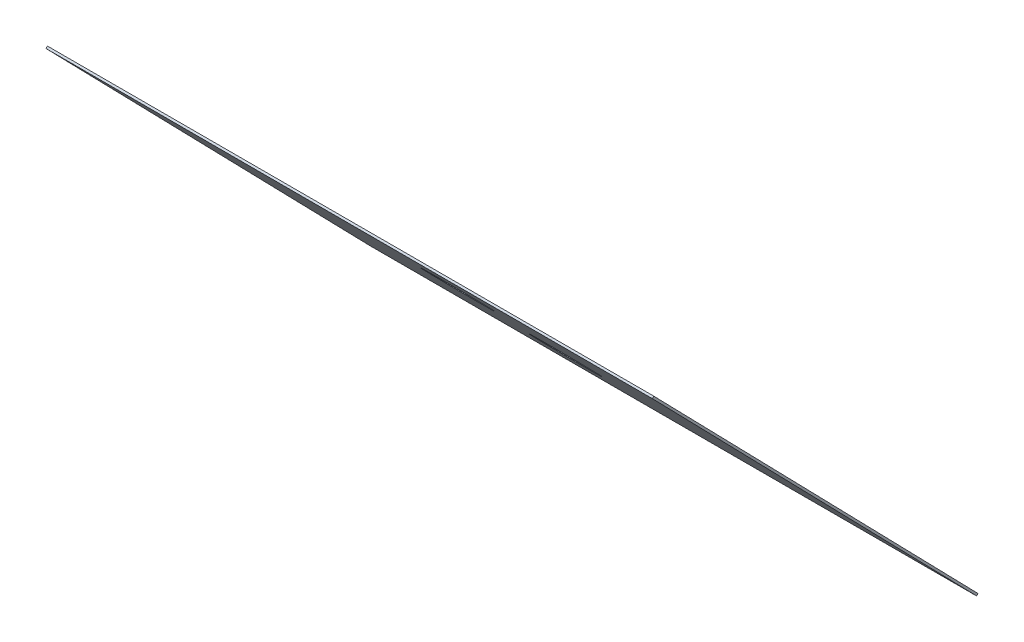
ISO-10303-21;
HEADER;
FILE_DESCRIPTION(('STEP AP214'),'2;1');
FILE_NAME('part.step','',(''),(''),'','','');
FILE_SCHEMA(('AUTOMOTIVE_DESIGN { 1 0 10303 214 1 1 1 1 }'));
ENDSEC;
DATA;
#1=APPLICATION_CONTEXT('core data for automotive mechanical design processes');
#2=APPLICATION_PROTOCOL_DEFINITION('international standard','automotive_design',2000,#1);
#3=PRODUCT_CONTEXT('',#1,'mechanical');
#4=PRODUCT('Part','Part','',(#3));
#5=PRODUCT_RELATED_PRODUCT_CATEGORY('part','',(#4));
#6=PRODUCT_DEFINITION_FORMATION('','',#4);
#7=PRODUCT_DEFINITION_CONTEXT('part definition',#1,'design');
#8=PRODUCT_DEFINITION('design','',#6,#7);
#9=PRODUCT_DEFINITION_SHAPE('','',#8);
#10=(LENGTH_UNIT() NAMED_UNIT(*) SI_UNIT(.MILLI.,.METRE.));
#11=(NAMED_UNIT(*) PLANE_ANGLE_UNIT() SI_UNIT($,.RADIAN.));
#12=(NAMED_UNIT(*) SI_UNIT($,.STERADIAN.) SOLID_ANGLE_UNIT());
#13=UNCERTAINTY_MEASURE_WITH_UNIT(LENGTH_MEASURE(1.E-05),#10,'distance_accuracy_value','');
#14=(GEOMETRIC_REPRESENTATION_CONTEXT(3) GLOBAL_UNCERTAINTY_ASSIGNED_CONTEXT((#13)) GLOBAL_UNIT_ASSIGNED_CONTEXT((#10,
#11,#12)) REPRESENTATION_CONTEXT('',''));
#15=CARTESIAN_POINT('',(0.,0.,0.));
#16=DIRECTION('',(0.,0.,1.));
#17=DIRECTION('',(1.,0.,0.));
#18=AXIS2_PLACEMENT_3D('',#15,#16,#17);
#19=CARTESIAN_POINT('',(0.,14.6685190391763,74.2782506140871));
#20=DIRECTION('',(-1.,0.,0.));
#21=DIRECTION('',(0.,-0.716524168938912,-0.697562266271909));
#22=AXIS2_PLACEMENT_3D('',#19,#20,#21);
#23=PLANE('',#22);
#24=DIRECTION('',(0.,-0.697562266271909,0.716524168938912));
#25=VECTOR('',#24,1.);
#26=CARTESIAN_POINT('',(0.,14.6685190391763,74.2782506140871));
#27=LINE('',#26,#25);
#28=CARTESIAN_POINT('',(0.,14.7382752658035,74.2065981971932));
#29=VERTEX_POINT('',#28);
#30=CARTESIAN_POINT('',(0.,14.6685190391763,74.2782506140871));
#31=VERTEX_POINT('',#30);
#32=EDGE_CURVE('E11',#29,#31,#27,.T.);
#33=ORIENTED_EDGE('',*,*,#32,.F.);
#34=DIRECTION('',(0.,-0.716524168938912,-0.697562266271909));
#35=VECTOR('',#34,1.);
#36=CARTESIAN_POINT('',(0.,14.7382752658035,74.2065981971932));
#37=LINE('',#36,#35);
#38=CARTESIAN_POINT('',(0.,-1.74178061979143,58.1626660729393));
#39=VERTEX_POINT('',#38);
#40=EDGE_CURVE('E88',#29,#39,#37,.T.);
#41=ORIENTED_EDGE('',*,*,#40,.T.);
#42=DIRECTION('',(0.,-0.697562266271909,0.716524168938912));
#43=VECTOR('',#42,1.);
#44=CARTESIAN_POINT('',(0.,-1.81153684641863,58.2343184898332));
#45=LINE('',#44,#43);
#46=CARTESIAN_POINT('',(0.,-1.81153684641863,58.2343184898332));
#47=VERTEX_POINT('',#46);
#48=EDGE_CURVE('E43',#39,#47,#45,.T.);
#49=ORIENTED_EDGE('',*,*,#48,.T.);
#50=DIRECTION('',(0.,-0.716524168938912,-0.697562266271909));
#51=VECTOR('',#50,1.);
#52=CARTESIAN_POINT('',(0.,14.6685190391763,74.2782506140871));
#53=LINE('',#52,#51);
#54=EDGE_CURVE('E105',#31,#47,#53,.T.);
#55=ORIENTED_EDGE('',*,*,#54,.F.);
#56=EDGE_LOOP('',(#33,#41,#49,#55));
#57=FACE_BOUND('',#56,.T.);
#58=ADVANCED_FACE('F33',(#57),#23,.T.);
#59=CARTESIAN_POINT('',(0.,-1.81153684641863,58.2343184898332));
#60=DIRECTION('',(0.,-0.716524168938912,-0.697562266271909));
#61=DIRECTION('',(1.,0.,0.));
#62=AXIS2_PLACEMENT_3D('',#59,#60,#61);
#63=PLANE('',#62);
#64=ORIENTED_EDGE('',*,*,#48,.F.);
#65=DIRECTION('',(1.,0.,0.));
#66=VECTOR('',#65,1.);
#67=CARTESIAN_POINT('',(0.,-1.74178061979143,58.1626660729393));
#68=LINE('',#67,#66);
#69=CARTESIAN_POINT('',(30.,-1.74178061979143,58.1626660729393));
#70=VERTEX_POINT('',#69);
#71=EDGE_CURVE('E99',#39,#70,#68,.T.);
#72=ORIENTED_EDGE('',*,*,#71,.T.);
#73=DIRECTION('',(0.,-0.697562266271909,0.716524168938912));
#74=VECTOR('',#73,1.);
#75=CARTESIAN_POINT('',(30.,-1.81153684641863,58.2343184898332));
#76=LINE('',#75,#74);
#77=CARTESIAN_POINT('',(30.,-1.81153684641863,58.2343184898332));
#78=VERTEX_POINT('',#77);
#79=EDGE_CURVE('E51',#70,#78,#76,.T.);
#80=ORIENTED_EDGE('',*,*,#79,.T.);
#81=DIRECTION('',(1.,0.,0.));
#82=VECTOR('',#81,1.);
#83=CARTESIAN_POINT('',(0.,-1.81153684641863,58.2343184898332));
#84=LINE('',#83,#82);
#85=EDGE_CURVE('E82',#47,#78,#84,.T.);
#86=ORIENTED_EDGE('',*,*,#85,.F.);
#87=EDGE_LOOP('',(#64,#72,#80,#86));
#88=FACE_BOUND('',#87,.T.);
#89=ADVANCED_FACE('F109',(#88),#63,.T.);
#90=CARTESIAN_POINT('',(30.,14.6685190391763,74.2782506140871));
#91=DIRECTION('',(-1.,0.,0.));
#92=DIRECTION('',(0.,-0.716524168938912,-0.697562266271909));
#93=AXIS2_PLACEMENT_3D('',#90,#91,#92);
#94=PLANE('',#93);
#95=ORIENTED_EDGE('',*,*,#79,.F.);
#96=DIRECTION('',(0.,-0.716524168938912,-0.697562266271909));
#97=VECTOR('',#96,1.);
#98=CARTESIAN_POINT('',(30.,14.7382752658035,74.2065981971932));
#99=LINE('',#98,#97);
#100=CARTESIAN_POINT('',(30.,14.7382752658035,74.2065981971932));
#101=VERTEX_POINT('',#100);
#102=EDGE_CURVE('E87',#101,#70,#99,.T.);
#103=ORIENTED_EDGE('',*,*,#102,.F.);
#104=DIRECTION('',(0.,-0.697562266271909,0.716524168938912));
#105=VECTOR('',#104,1.);
#106=CARTESIAN_POINT('',(30.,14.6685190391763,74.2782506140871));
#107=LINE('',#106,#105);
#108=CARTESIAN_POINT('',(30.,14.6685190391763,74.2782506140871));
#109=VERTEX_POINT('',#108);
#110=EDGE_CURVE('E37',#101,#109,#107,.T.);
#111=ORIENTED_EDGE('',*,*,#110,.T.);
#112=DIRECTION('',(0.,-0.716524168938912,-0.697562266271909));
#113=VECTOR('',#112,1.);
#114=CARTESIAN_POINT('',(30.,14.6685190391763,74.2782506140871));
#115=LINE('',#114,#113);
#116=EDGE_CURVE('E101',#109,#78,#115,.T.);
#117=ORIENTED_EDGE('',*,*,#116,.T.);
#118=EDGE_LOOP('',(#95,#103,#111,#117));
#119=FACE_BOUND('',#118,.T.);
#120=ADVANCED_FACE('F90',(#119),#94,.F.);
#121=CARTESIAN_POINT('',(0.,14.6685190391763,74.2782506140871));
#122=DIRECTION('',(0.,-0.716524168938912,-0.697562266271909));
#123=DIRECTION('',(1.,0.,0.));
#124=AXIS2_PLACEMENT_3D('',#121,#122,#123);
#125=PLANE('',#124);
#126=DIRECTION('',(1.,0.,0.));
#127=VECTOR('',#126,1.);
#128=CARTESIAN_POINT('',(0.,14.7382752658035,74.2065981971932));
#129=LINE('',#128,#127);
#130=EDGE_CURVE('E76',#29,#101,#129,.T.);
#131=ORIENTED_EDGE('',*,*,#130,.F.);
#132=ORIENTED_EDGE('',*,*,#32,.T.);
#133=DIRECTION('',(1.,0.,0.));
#134=VECTOR('',#133,1.);
#135=CARTESIAN_POINT('',(0.,14.6685190391763,74.2782506140871));
#136=LINE('',#135,#134);
#137=EDGE_CURVE('E78',#31,#109,#136,.T.);
#138=ORIENTED_EDGE('',*,*,#137,.T.);
#139=ORIENTED_EDGE('',*,*,#110,.F.);
#140=EDGE_LOOP('',(#131,#132,#138,#139));
#141=FACE_BOUND('',#140,.T.);
#142=ADVANCED_FACE('F35',(#141),#125,.F.);
#143=CARTESIAN_POINT('',(0.,14.6685190391763,74.2782506140871));
#144=DIRECTION('',(0.,-0.697562266271909,0.716524168938912));
#145=DIRECTION('',(0.,-0.716524168938912,-0.697562266271909));
#146=AXIS2_PLACEMENT_3D('',#143,#144,#145);
#147=PLANE('',#146);
#148=CARTESIAN_POINT('',(15.,9.17516707731135,68.9302732393358));
#149=DIRECTION('',(0.,-0.69756226627191,0.716524168938911));
#150=DIRECTION('',(0.,-0.716524168938911,-0.69756226627191));
#151=AXIS2_PLACEMENT_3D('',#148,#149,#150);
#152=CIRCLE('',#151,1.5);
#153=CARTESIAN_POINT('',(15.,8.10038082390298,67.883929839928));
#154=VERTEX_POINT('',#153);
#155=EDGE_CURVE('E94',#154,#154,#152,.T.);
#156=ORIENTED_EDGE('',*,*,#155,.F.);
#157=EDGE_LOOP('',(#156));
#158=FACE_BOUND('',#157,.T.);
#159=CARTESIAN_POINT('',(15.,3.68181511544636,63.5822958645845));
#160=DIRECTION('',(0.,-0.69756226627191,0.716524168938911));
#161=DIRECTION('',(0.,-0.716524168938911,-0.69756226627191));
#162=AXIS2_PLACEMENT_3D('',#159,#160,#161);
#163=CIRCLE('',#162,1.5);
#164=CARTESIAN_POINT('',(15.,2.60702886203799,62.5359524651767));
#165=VERTEX_POINT('',#164);
#166=EDGE_CURVE('E116',#165,#165,#163,.T.);
#167=ORIENTED_EDGE('',*,*,#166,.F.);
#168=EDGE_LOOP('',(#167));
#169=FACE_BOUND('',#168,.T.);
#170=ORIENTED_EDGE('',*,*,#116,.F.);
#171=ORIENTED_EDGE('',*,*,#137,.F.);
#172=ORIENTED_EDGE('',*,*,#54,.T.);
#173=ORIENTED_EDGE('',*,*,#85,.T.);
#174=EDGE_LOOP('',(#170,#171,#172,#173));
#175=FACE_BOUND('',#174,.T.);
#176=ADVANCED_FACE('F108',(#158,#169,#175),#147,.T.);
#177=CARTESIAN_POINT('',(0.,14.7382752658035,74.2065981971932));
#178=DIRECTION('',(0.,-0.697562266271909,0.716524168938912));
#179=DIRECTION('',(0.,-0.716524168938912,-0.697562266271909));
#180=AXIS2_PLACEMENT_3D('',#177,#178,#179);
#181=PLANE('',#180);
#182=CARTESIAN_POINT('',(15.,9.24492330393854,68.858620822442));
#183=DIRECTION('',(0.,-0.697562266271909,0.716524168938912));
#184=DIRECTION('',(0.,-0.716524168938912,-0.697562266271909));
#185=AXIS2_PLACEMENT_3D('',#182,#183,#184);
#186=CIRCLE('',#185,1.5);
#187=CARTESIAN_POINT('',(15.,8.17013705053018,67.8122774230341));
#188=VERTEX_POINT('',#187);
#189=EDGE_CURVE('E91',#188,#188,#186,.F.);
#190=ORIENTED_EDGE('',*,*,#189,.F.);
#191=EDGE_LOOP('',(#190));
#192=FACE_BOUND('',#191,.T.);
#193=CARTESIAN_POINT('',(15.,3.75157134207355,63.5106434476906));
#194=DIRECTION('',(0.,-0.697562266271909,0.716524168938912));
#195=DIRECTION('',(0.,-0.716524168938912,-0.697562266271909));
#196=AXIS2_PLACEMENT_3D('',#193,#194,#195);
#197=CIRCLE('',#196,1.5);
#198=CARTESIAN_POINT('',(15.,2.67678508866518,62.4643000482828));
#199=VERTEX_POINT('',#198);
#200=EDGE_CURVE('E113',#199,#199,#197,.F.);
#201=ORIENTED_EDGE('',*,*,#200,.F.);
#202=EDGE_LOOP('',(#201));
#203=FACE_BOUND('',#202,.T.);
#204=ORIENTED_EDGE('',*,*,#102,.T.);
#205=ORIENTED_EDGE('',*,*,#71,.F.);
#206=ORIENTED_EDGE('',*,*,#40,.F.);
#207=ORIENTED_EDGE('',*,*,#130,.T.);
#208=EDGE_LOOP('',(#204,#205,#206,#207));
#209=FACE_BOUND('',#208,.T.);
#210=ADVANCED_FACE('F85',(#192,#203,#209),#181,.F.);
#211=CARTESIAN_POINT('',(15.,86.5060055071306,-21.4933125188926));
#212=DIRECTION('',(0.,-0.69756226627191,0.716524168938911));
#213=DIRECTION('',(0.,-0.716524168938911,-0.69756226627191));
#214=AXIS2_PLACEMENT_3D('',#211,#212,#213);
#215=CYLINDRICAL_SURFACE('',#214,1.5);
#216=ORIENTED_EDGE('',*,*,#166,.T.);
#217=EDGE_LOOP('',(#216));
#218=FACE_BOUND('',#217,.T.);
#219=ORIENTED_EDGE('',*,*,#200,.T.);
#220=EDGE_LOOP('',(#219));
#221=FACE_BOUND('',#220,.T.);
#222=ADVANCED_FACE('F130',(#218,#221),#215,.F.);
#223=CARTESIAN_POINT('',(15.,91.9993574689956,-16.1453351441412));
#224=DIRECTION('',(0.,-0.69756226627191,0.716524168938911));
#225=DIRECTION('',(0.,-0.716524168938911,-0.69756226627191));
#226=AXIS2_PLACEMENT_3D('',#223,#224,#225);
#227=CYLINDRICAL_SURFACE('',#226,1.5);
#228=ORIENTED_EDGE('',*,*,#155,.T.);
#229=EDGE_LOOP('',(#228));
#230=FACE_BOUND('',#229,.T.);
#231=ORIENTED_EDGE('',*,*,#189,.T.);
#232=EDGE_LOOP('',(#231));
#233=FACE_BOUND('',#232,.T.);
#234=ADVANCED_FACE('F122',(#230,#233),#227,.F.);
#235=CLOSED_SHELL('',(#58,#89,#120,#142,#176,#210,#222,#234));
#236=MANIFOLD_SOLID_BREP('B2',#235);
#237=ADVANCED_BREP_SHAPE_REPRESENTATION('',(#18,#236),#14);
#238=SHAPE_DEFINITION_REPRESENTATION(#9,#237);
ENDSEC;
END-ISO-10303-21;
